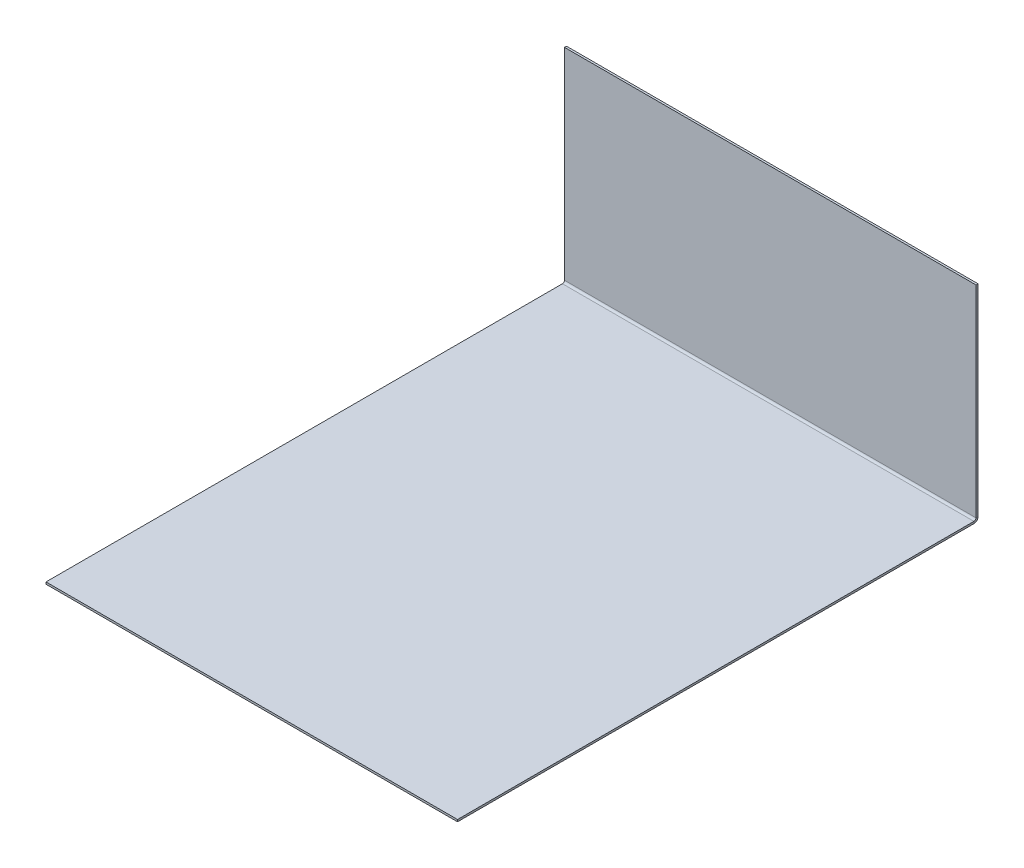
ISO-10303-21;
HEADER;
FILE_DESCRIPTION(('STEP AP214'),'2;1');
FILE_NAME('part.step','',(''),(''),'','','');
FILE_SCHEMA(('AUTOMOTIVE_DESIGN { 1 0 10303 214 1 1 1 1 }'));
ENDSEC;
DATA;
#1=APPLICATION_CONTEXT('core data for automotive mechanical design processes');
#2=APPLICATION_PROTOCOL_DEFINITION('international standard','automotive_design',2000,#1);
#3=PRODUCT_CONTEXT('',#1,'mechanical');
#4=PRODUCT('Part','Part','',(#3));
#5=PRODUCT_RELATED_PRODUCT_CATEGORY('part','',(#4));
#6=PRODUCT_DEFINITION_FORMATION('','',#4);
#7=PRODUCT_DEFINITION_CONTEXT('part definition',#1,'design');
#8=PRODUCT_DEFINITION('design','',#6,#7);
#9=PRODUCT_DEFINITION_SHAPE('','',#8);
#10=(LENGTH_UNIT() NAMED_UNIT(*) SI_UNIT(.MILLI.,.METRE.));
#11=(NAMED_UNIT(*) PLANE_ANGLE_UNIT() SI_UNIT($,.RADIAN.));
#12=(NAMED_UNIT(*) SI_UNIT($,.STERADIAN.) SOLID_ANGLE_UNIT());
#13=UNCERTAINTY_MEASURE_WITH_UNIT(LENGTH_MEASURE(1.E-05),#10,'distance_accuracy_value','');
#14=(GEOMETRIC_REPRESENTATION_CONTEXT(3) GLOBAL_UNCERTAINTY_ASSIGNED_CONTEXT((#13)) GLOBAL_UNIT_ASSIGNED_CONTEXT((#10,
#11,#12)) REPRESENTATION_CONTEXT('',''));
#15=CARTESIAN_POINT('',(0.,0.,0.));
#16=DIRECTION('',(0.,0.,1.));
#17=DIRECTION('',(1.,0.,0.));
#18=AXIS2_PLACEMENT_3D('',#15,#16,#17);
#19=CARTESIAN_POINT('',(101.6,-1.,127.));
#20=DIRECTION('',(1.,0.,0.));
#21=DIRECTION('',(0.,0.,-1.));
#22=AXIS2_PLACEMENT_3D('',#19,#20,#21);
#23=PLANE('',#22);
#24=DIRECTION('',(0.,0.,-1.));
#25=VECTOR('',#24,1.);
#26=CARTESIAN_POINT('',(101.6,0.,127.));
#27=LINE('',#26,#25);
#28=CARTESIAN_POINT('',(101.6,0.,127.));
#29=VERTEX_POINT('',#28);
#30=CARTESIAN_POINT('',(101.6,0.,-128.));
#31=VERTEX_POINT('',#30);
#32=EDGE_CURVE('E181',#29,#31,#27,.T.);
#33=ORIENTED_EDGE('',*,*,#32,.F.);
#34=DIRECTION('',(0.,1.,0.));
#35=VECTOR('',#34,1.);
#36=CARTESIAN_POINT('',(101.6,-1.,127.));
#37=LINE('',#36,#35);
#38=CARTESIAN_POINT('',(101.6,-1.,127.));
#39=VERTEX_POINT('',#38);
#40=EDGE_CURVE('E13',#39,#29,#37,.T.);
#41=ORIENTED_EDGE('',*,*,#40,.F.);
#42=DIRECTION('',(0.,0.,-1.));
#43=VECTOR('',#42,1.);
#44=CARTESIAN_POINT('',(101.6,-1.,127.));
#45=LINE('',#44,#43);
#46=CARTESIAN_POINT('',(101.6,-1.00000000000001,-128.));
#47=VERTEX_POINT('',#46);
#48=EDGE_CURVE('E184',#39,#47,#45,.T.);
#49=ORIENTED_EDGE('',*,*,#48,.T.);
#50=DIRECTION('',(0.,-1.,0.));
#51=VECTOR('',#50,1.);
#52=CARTESIAN_POINT('',(101.6,0.,-128.));
#53=LINE('',#52,#51);
#54=EDGE_CURVE('E179',#31,#47,#53,.T.);
#55=ORIENTED_EDGE('',*,*,#54,.F.);
#56=EDGE_LOOP('',(#33,#41,#49,#55));
#57=FACE_BOUND('',#56,.T.);
#58=ADVANCED_FACE('F55',(#57),#23,.T.);
#59=CARTESIAN_POINT('',(-101.6,-1.,127.));
#60=DIRECTION('',(0.,0.,1.));
#61=DIRECTION('',(1.,0.,0.));
#62=AXIS2_PLACEMENT_3D('',#59,#60,#61);
#63=PLANE('',#62);
#64=DIRECTION('',(1.,0.,0.));
#65=VECTOR('',#64,1.);
#66=CARTESIAN_POINT('',(-101.6,0.,127.));
#67=LINE('',#66,#65);
#68=CARTESIAN_POINT('',(-101.6,0.,127.));
#69=VERTEX_POINT('',#68);
#70=EDGE_CURVE('E187',#69,#29,#67,.T.);
#71=ORIENTED_EDGE('',*,*,#70,.F.);
#72=DIRECTION('',(0.,1.,0.));
#73=VECTOR('',#72,1.);
#74=CARTESIAN_POINT('',(-101.6,-1.,127.));
#75=LINE('',#74,#73);
#76=CARTESIAN_POINT('',(-101.6,-1.,127.));
#77=VERTEX_POINT('',#76);
#78=EDGE_CURVE('E58',#77,#69,#75,.T.);
#79=ORIENTED_EDGE('',*,*,#78,.F.);
#80=DIRECTION('',(1.,0.,0.));
#81=VECTOR('',#80,1.);
#82=CARTESIAN_POINT('',(-101.6,-1.,127.));
#83=LINE('',#82,#81);
#84=EDGE_CURVE('E189',#77,#39,#83,.T.);
#85=ORIENTED_EDGE('',*,*,#84,.T.);
#86=ORIENTED_EDGE('',*,*,#40,.T.);
#87=EDGE_LOOP('',(#71,#79,#85,#86));
#88=FACE_BOUND('',#87,.T.);
#89=ADVANCED_FACE('F203',(#88),#63,.T.);
#90=CARTESIAN_POINT('',(-101.6,-1.,127.));
#91=DIRECTION('',(-1.,0.,0.));
#92=DIRECTION('',(0.,0.,1.));
#93=AXIS2_PLACEMENT_3D('',#90,#91,#92);
#94=PLANE('',#93);
#95=DIRECTION('',(0.,0.,1.));
#96=VECTOR('',#95,1.);
#97=CARTESIAN_POINT('',(-101.6,0.,127.));
#98=LINE('',#97,#96);
#99=CARTESIAN_POINT('',(-101.6,0.,-128.));
#100=VERTEX_POINT('',#99);
#101=EDGE_CURVE('E194',#100,#69,#98,.T.);
#102=ORIENTED_EDGE('',*,*,#101,.F.);
#103=DIRECTION('',(0.,-1.,0.));
#104=VECTOR('',#103,1.);
#105=CARTESIAN_POINT('',(-101.6,0.,-128.));
#106=LINE('',#105,#104);
#107=CARTESIAN_POINT('',(-101.6,-1.00000000000001,-128.));
#108=VERTEX_POINT('',#107);
#109=EDGE_CURVE('E168',#100,#108,#106,.T.);
#110=ORIENTED_EDGE('',*,*,#109,.T.);
#111=DIRECTION('',(0.,0.,1.));
#112=VECTOR('',#111,1.);
#113=CARTESIAN_POINT('',(-101.6,-1.,127.));
#114=LINE('',#113,#112);
#115=EDGE_CURVE('E186',#108,#77,#114,.T.);
#116=ORIENTED_EDGE('',*,*,#115,.T.);
#117=ORIENTED_EDGE('',*,*,#78,.T.);
#118=EDGE_LOOP('',(#102,#110,#116,#117));
#119=FACE_BOUND('',#118,.T.);
#120=ADVANCED_FACE('F225',(#119),#94,.T.);
#121=CARTESIAN_POINT('',(0.,-1.,0.));
#122=DIRECTION('',(0.,-1.,0.));
#123=DIRECTION('',(0.,0.,-1.));
#124=AXIS2_PLACEMENT_3D('',#121,#122,#123);
#125=PLANE('',#124);
#126=ORIENTED_EDGE('',*,*,#48,.F.);
#127=ORIENTED_EDGE('',*,*,#84,.F.);
#128=ORIENTED_EDGE('',*,*,#115,.F.);
#129=DIRECTION('',(-1.,0.,0.));
#130=VECTOR('',#129,1.);
#131=CARTESIAN_POINT('',(-101.6,-1.00000000000001,-128.));
#132=LINE('',#131,#130);
#133=EDGE_CURVE('E163',#108,#47,#132,.F.);
#134=ORIENTED_EDGE('',*,*,#133,.T.);
#135=EDGE_LOOP('',(#126,#127,#128,#134));
#136=FACE_BOUND('',#135,.T.);
#137=ADVANCED_FACE('F224',(#136),#125,.T.);
#138=CARTESIAN_POINT('',(0.,0.,0.));
#139=DIRECTION('',(0.,-1.,0.));
#140=DIRECTION('',(0.,0.,-1.));
#141=AXIS2_PLACEMENT_3D('',#138,#139,#140);
#142=PLANE('',#141);
#143=ORIENTED_EDGE('',*,*,#32,.T.);
#144=DIRECTION('',(-1.,0.,0.));
#145=VECTOR('',#144,1.);
#146=CARTESIAN_POINT('',(-101.6,0.,-128.));
#147=LINE('',#146,#145);
#148=EDGE_CURVE('E174',#100,#31,#147,.F.);
#149=ORIENTED_EDGE('',*,*,#148,.F.);
#150=ORIENTED_EDGE('',*,*,#101,.T.);
#151=ORIENTED_EDGE('',*,*,#70,.T.);
#152=EDGE_LOOP('',(#143,#149,#150,#151));
#153=FACE_BOUND('',#152,.T.);
#154=ADVANCED_FACE('F199',(#153),#142,.F.);
#155=CARTESIAN_POINT('',(101.6,0.999999999999994,-128.));
#156=DIRECTION('',(1.,0.,0.));
#157=DIRECTION('',(0.,0.,-1.));
#158=AXIS2_PLACEMENT_3D('',#155,#156,#157);
#159=PLANE('',#158);
#160=DIRECTION('',(0.,0.,1.));
#161=VECTOR('',#160,1.);
#162=CARTESIAN_POINT('',(101.6,1.00000000000001,-130.));
#163=LINE('',#162,#161);
#164=CARTESIAN_POINT('',(101.6,0.99999999999999,-129.));
#165=VERTEX_POINT('',#164);
#166=CARTESIAN_POINT('',(101.6,0.999999999999987,-130.));
#167=VERTEX_POINT('',#166);
#168=EDGE_CURVE('E146',#165,#167,#163,.F.);
#169=ORIENTED_EDGE('',*,*,#168,.F.);
#170=CARTESIAN_POINT('',(101.6,0.999999999999994,-128.));
#171=DIRECTION('',(-1.,0.,0.));
#172=DIRECTION('',(0.,0.,1.));
#173=AXIS2_PLACEMENT_3D('',#170,#171,#172);
#174=CIRCLE('',#173,1.);
#175=EDGE_CURVE('E171',#31,#165,#174,.F.);
#176=ORIENTED_EDGE('',*,*,#175,.F.);
#177=ORIENTED_EDGE('',*,*,#54,.T.);
#178=CARTESIAN_POINT('',(101.6,0.999999999999994,-128.));
#179=DIRECTION('',(-1.,0.,0.));
#180=DIRECTION('',(0.,0.,1.));
#181=AXIS2_PLACEMENT_3D('',#178,#179,#180);
#182=CIRCLE('',#181,2.);
#183=EDGE_CURVE('E87',#47,#167,#182,.F.);
#184=ORIENTED_EDGE('',*,*,#183,.T.);
#185=EDGE_LOOP('',(#169,#176,#177,#184));
#186=FACE_BOUND('',#185,.T.);
#187=ADVANCED_FACE('F207',(#186),#159,.T.);
#188=CARTESIAN_POINT('',(-101.6,0.999999999999994,-128.));
#189=DIRECTION('',(1.,0.,0.));
#190=DIRECTION('',(0.,0.,-1.));
#191=AXIS2_PLACEMENT_3D('',#188,#189,#190);
#192=PLANE('',#191);
#193=CARTESIAN_POINT('',(-101.6,0.999999999999994,-128.));
#194=DIRECTION('',(-1.,0.,0.));
#195=DIRECTION('',(0.,0.,1.));
#196=AXIS2_PLACEMENT_3D('',#193,#194,#195);
#197=CIRCLE('',#196,1.);
#198=CARTESIAN_POINT('',(-101.6,0.99999999999999,-129.));
#199=VERTEX_POINT('',#198);
#200=EDGE_CURVE('E176',#199,#100,#197,.T.);
#201=ORIENTED_EDGE('',*,*,#200,.F.);
#202=DIRECTION('',(0.,0.,1.));
#203=VECTOR('',#202,1.);
#204=CARTESIAN_POINT('',(-101.6,1.,-129.));
#205=LINE('',#204,#203);
#206=CARTESIAN_POINT('',(-101.6,1.00000000000001,-130.));
#207=VERTEX_POINT('',#206);
#208=EDGE_CURVE('E157',#199,#207,#205,.F.);
#209=ORIENTED_EDGE('',*,*,#208,.T.);
#210=CARTESIAN_POINT('',(-101.6,0.999999999999994,-128.));
#211=DIRECTION('',(-1.,0.,0.));
#212=DIRECTION('',(0.,0.,1.));
#213=AXIS2_PLACEMENT_3D('',#210,#211,#212);
#214=CIRCLE('',#213,2.);
#215=EDGE_CURVE('E166',#207,#108,#214,.T.);
#216=ORIENTED_EDGE('',*,*,#215,.T.);
#217=ORIENTED_EDGE('',*,*,#109,.F.);
#218=EDGE_LOOP('',(#201,#209,#216,#217));
#219=FACE_BOUND('',#218,.T.);
#220=ADVANCED_FACE('F220',(#219),#192,.F.);
#221=CARTESIAN_POINT('',(-101.6,0.999999999999994,-128.));
#222=DIRECTION('',(-1.,0.,0.));
#223=DIRECTION('',(0.,0.,-1.));
#224=AXIS2_PLACEMENT_3D('',#221,#222,#223);
#225=CYLINDRICAL_SURFACE('',#224,2.);
#226=ORIENTED_EDGE('',*,*,#133,.F.);
#227=ORIENTED_EDGE('',*,*,#215,.F.);
#228=DIRECTION('',(-1.,0.,0.));
#229=VECTOR('',#228,1.);
#230=CARTESIAN_POINT('',(101.6,1.00000000000001,-130.));
#231=LINE('',#230,#229);
#232=EDGE_CURVE('E155',#207,#167,#231,.F.);
#233=ORIENTED_EDGE('',*,*,#232,.T.);
#234=ORIENTED_EDGE('',*,*,#183,.F.);
#235=EDGE_LOOP('',(#226,#227,#233,#234));
#236=FACE_BOUND('',#235,.T.);
#237=ADVANCED_FACE('F222',(#236),#225,.T.);
#238=CARTESIAN_POINT('',(-101.6,0.999999999999994,-128.));
#239=DIRECTION('',(-1.,0.,0.));
#240=DIRECTION('',(0.,0.,-1.));
#241=AXIS2_PLACEMENT_3D('',#238,#239,#240);
#242=CYLINDRICAL_SURFACE('',#241,1.);
#243=ORIENTED_EDGE('',*,*,#148,.T.);
#244=ORIENTED_EDGE('',*,*,#175,.T.);
#245=DIRECTION('',(-1.,0.,0.));
#246=VECTOR('',#245,1.);
#247=CARTESIAN_POINT('',(101.6,1.,-129.));
#248=LINE('',#247,#246);
#249=EDGE_CURVE('E160',#165,#199,#248,.T.);
#250=ORIENTED_EDGE('',*,*,#249,.T.);
#251=ORIENTED_EDGE('',*,*,#200,.T.);
#252=EDGE_LOOP('',(#243,#244,#250,#251));
#253=FACE_BOUND('',#252,.T.);
#254=ADVANCED_FACE('F210',(#253),#242,.F.);
#255=CARTESIAN_POINT('',(101.6,0.,-130.));
#256=DIRECTION('',(-1.,0.,0.));
#257=DIRECTION('',(0.,0.,1.));
#258=AXIS2_PLACEMENT_3D('',#255,#256,#257);
#259=PLANE('',#258);
#260=ORIENTED_EDGE('',*,*,#168,.T.);
#261=DIRECTION('',(0.,-1.,0.));
#262=VECTOR('',#261,1.);
#263=CARTESIAN_POINT('',(101.6,-4.59002965845835E-13,-130.));
#264=LINE('',#263,#262);
#265=CARTESIAN_POINT('',(101.6,100.6,-130.));
#266=VERTEX_POINT('',#265);
#267=EDGE_CURVE('E127',#266,#167,#264,.T.);
#268=ORIENTED_EDGE('',*,*,#267,.F.);
#269=DIRECTION('',(0.,0.,1.));
#270=VECTOR('',#269,1.);
#271=CARTESIAN_POINT('',(101.6,100.6,-130.));
#272=LINE('',#271,#270);
#273=CARTESIAN_POINT('',(101.6,100.6,-129.));
#274=VERTEX_POINT('',#273);
#275=EDGE_CURVE('E133',#266,#274,#272,.T.);
#276=ORIENTED_EDGE('',*,*,#275,.T.);
#277=DIRECTION('',(0.,1.,0.));
#278=VECTOR('',#277,1.);
#279=CARTESIAN_POINT('',(101.6,0.,-129.));
#280=LINE('',#279,#278);
#281=EDGE_CURVE('E153',#274,#165,#280,.F.);
#282=ORIENTED_EDGE('',*,*,#281,.T.);
#283=EDGE_LOOP('',(#260,#268,#276,#282));
#284=FACE_BOUND('',#283,.T.);
#285=ADVANCED_FACE('F145',(#284),#259,.F.);
#286=CARTESIAN_POINT('',(-101.6,100.6,-130.));
#287=DIRECTION('',(1.,0.,0.));
#288=DIRECTION('',(0.,0.,-1.));
#289=AXIS2_PLACEMENT_3D('',#286,#287,#288);
#290=PLANE('',#289);
#291=ORIENTED_EDGE('',*,*,#208,.F.);
#292=DIRECTION('',(0.,-1.,0.));
#293=VECTOR('',#292,1.);
#294=CARTESIAN_POINT('',(-101.6,100.6,-129.));
#295=LINE('',#294,#293);
#296=CARTESIAN_POINT('',(-101.6,100.6,-129.));
#297=VERTEX_POINT('',#296);
#298=EDGE_CURVE('E149',#199,#297,#295,.F.);
#299=ORIENTED_EDGE('',*,*,#298,.T.);
#300=DIRECTION('',(0.,0.,1.));
#301=VECTOR('',#300,1.);
#302=CARTESIAN_POINT('',(-101.6,100.6,-130.));
#303=LINE('',#302,#301);
#304=CARTESIAN_POINT('',(-101.6,100.6,-130.));
#305=VERTEX_POINT('',#304);
#306=EDGE_CURVE('E142',#305,#297,#303,.T.);
#307=ORIENTED_EDGE('',*,*,#306,.F.);
#308=DIRECTION('',(0.,1.,0.));
#309=VECTOR('',#308,1.);
#310=CARTESIAN_POINT('',(-101.6,-4.59002965845835E-13,-130.));
#311=LINE('',#310,#309);
#312=EDGE_CURVE('E129',#207,#305,#311,.T.);
#313=ORIENTED_EDGE('',*,*,#312,.F.);
#314=EDGE_LOOP('',(#291,#299,#307,#313));
#315=FACE_BOUND('',#314,.T.);
#316=ADVANCED_FACE('F217',(#315),#290,.F.);
#317=CARTESIAN_POINT('',(0.,-4.59002965845835E-13,-130.));
#318=DIRECTION('',(0.,0.,1.));
#319=DIRECTION('',(0.,-1.,0.));
#320=AXIS2_PLACEMENT_3D('',#317,#318,#319);
#321=PLANE('',#320);
#322=ORIENTED_EDGE('',*,*,#232,.F.);
#323=ORIENTED_EDGE('',*,*,#312,.T.);
#324=DIRECTION('',(1.,0.,0.));
#325=VECTOR('',#324,1.);
#326=CARTESIAN_POINT('',(0.,100.6,-130.));
#327=LINE('',#326,#325);
#328=EDGE_CURVE('E122',#305,#266,#327,.T.);
#329=ORIENTED_EDGE('',*,*,#328,.T.);
#330=ORIENTED_EDGE('',*,*,#267,.T.);
#331=EDGE_LOOP('',(#322,#323,#329,#330));
#332=FACE_BOUND('',#331,.T.);
#333=ADVANCED_FACE('F125',(#332),#321,.F.);
#334=CARTESIAN_POINT('',(0.,-4.55511484506991E-13,-129.));
#335=DIRECTION('',(0.,0.,1.));
#336=DIRECTION('',(0.,-1.,0.));
#337=AXIS2_PLACEMENT_3D('',#334,#335,#336);
#338=PLANE('',#337);
#339=ORIENTED_EDGE('',*,*,#298,.F.);
#340=ORIENTED_EDGE('',*,*,#249,.F.);
#341=ORIENTED_EDGE('',*,*,#281,.F.);
#342=DIRECTION('',(-1.,0.,0.));
#343=VECTOR('',#342,1.);
#344=CARTESIAN_POINT('',(101.6,100.6,-129.));
#345=LINE('',#344,#343);
#346=EDGE_CURVE('E138',#297,#274,#345,.F.);
#347=ORIENTED_EDGE('',*,*,#346,.F.);
#348=EDGE_LOOP('',(#339,#340,#341,#347));
#349=FACE_BOUND('',#348,.T.);
#350=ADVANCED_FACE('F214',(#349),#338,.T.);
#351=CARTESIAN_POINT('',(101.6,100.6,-130.));
#352=DIRECTION('',(0.,-1.,0.));
#353=DIRECTION('',(0.,0.,-1.));
#354=AXIS2_PLACEMENT_3D('',#351,#352,#353);
#355=PLANE('',#354);
#356=ORIENTED_EDGE('',*,*,#346,.T.);
#357=ORIENTED_EDGE('',*,*,#275,.F.);
#358=ORIENTED_EDGE('',*,*,#328,.F.);
#359=ORIENTED_EDGE('',*,*,#306,.T.);
#360=EDGE_LOOP('',(#356,#357,#358,#359));
#361=FACE_BOUND('',#360,.T.);
#362=ADVANCED_FACE('F136',(#361),#355,.F.);
#363=CLOSED_SHELL('',(#58,#89,#120,#137,#154,#187,#220,#237,#254,#285,#316,#333,#350,#362));
#364=MANIFOLD_SOLID_BREP('B2',#363);
#365=ADVANCED_BREP_SHAPE_REPRESENTATION('',(#18,#364),#14);
#366=SHAPE_DEFINITION_REPRESENTATION(#9,#365);
ENDSEC;
END-ISO-10303-21;
